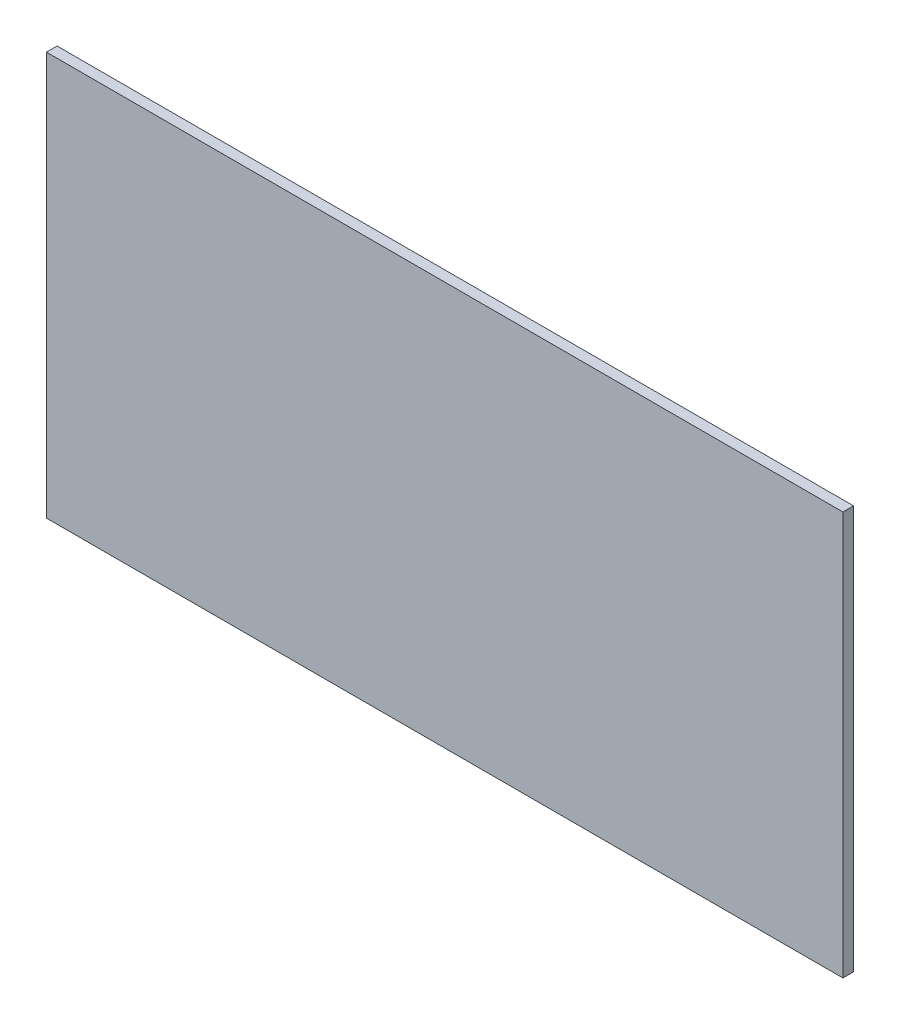
ISO-10303-21;
HEADER;
FILE_DESCRIPTION(('STEP AP214'),'2;1');
FILE_NAME('part.step','',(''),(''),'','','');
FILE_SCHEMA(('AUTOMOTIVE_DESIGN { 1 0 10303 214 1 1 1 1 }'));
ENDSEC;
DATA;
#1=APPLICATION_CONTEXT('core data for automotive mechanical design processes');
#2=APPLICATION_PROTOCOL_DEFINITION('international standard','automotive_design',2000,#1);
#3=PRODUCT_CONTEXT('',#1,'mechanical');
#4=PRODUCT('Part','Part','',(#3));
#5=PRODUCT_RELATED_PRODUCT_CATEGORY('part','',(#4));
#6=PRODUCT_DEFINITION_FORMATION('','',#4);
#7=PRODUCT_DEFINITION_CONTEXT('part definition',#1,'design');
#8=PRODUCT_DEFINITION('design','',#6,#7);
#9=PRODUCT_DEFINITION_SHAPE('','',#8);
#10=(LENGTH_UNIT() NAMED_UNIT(*) SI_UNIT(.MILLI.,.METRE.));
#11=(NAMED_UNIT(*) PLANE_ANGLE_UNIT() SI_UNIT($,.RADIAN.));
#12=(NAMED_UNIT(*) SI_UNIT($,.STERADIAN.) SOLID_ANGLE_UNIT());
#13=UNCERTAINTY_MEASURE_WITH_UNIT(LENGTH_MEASURE(1.E-05),#10,'distance_accuracy_value','');
#14=(GEOMETRIC_REPRESENTATION_CONTEXT(3) GLOBAL_UNCERTAINTY_ASSIGNED_CONTEXT((#13)) GLOBAL_UNIT_ASSIGNED_CONTEXT((#10,
#11,#12)) REPRESENTATION_CONTEXT('',''));
#15=CARTESIAN_POINT('',(0.,0.,0.));
#16=DIRECTION('',(0.,0.,1.));
#17=DIRECTION('',(1.,0.,0.));
#18=AXIS2_PLACEMENT_3D('',#15,#16,#17);
#19=CARTESIAN_POINT('',(37.5,-19.,1.));
#20=DIRECTION('',(-1.,0.,0.));
#21=DIRECTION('',(0.,0.,1.));
#22=AXIS2_PLACEMENT_3D('',#19,#20,#21);
#23=PLANE('',#22);
#24=DIRECTION('',(0.,1.,0.));
#25=VECTOR('',#24,1.);
#26=CARTESIAN_POINT('',(37.5,-19.,0.));
#27=LINE('',#26,#25);
#28=CARTESIAN_POINT('',(37.5,-19.,0.));
#29=VERTEX_POINT('',#28);
#30=CARTESIAN_POINT('',(37.5,19.,0.));
#31=VERTEX_POINT('',#30);
#32=EDGE_CURVE('E95',#29,#31,#27,.T.);
#33=ORIENTED_EDGE('',*,*,#32,.T.);
#34=DIRECTION('',(0.,0.,-1.));
#35=VECTOR('',#34,1.);
#36=CARTESIAN_POINT('',(37.5,19.,1.));
#37=LINE('',#36,#35);
#38=CARTESIAN_POINT('',(37.5,19.,1.));
#39=VERTEX_POINT('',#38);
#40=EDGE_CURVE('E11',#39,#31,#37,.T.);
#41=ORIENTED_EDGE('',*,*,#40,.F.);
#42=DIRECTION('',(0.,1.,0.));
#43=VECTOR('',#42,1.);
#44=CARTESIAN_POINT('',(37.5,-19.,1.));
#45=LINE('',#44,#43);
#46=CARTESIAN_POINT('',(37.5,-19.,1.));
#47=VERTEX_POINT('',#46);
#48=EDGE_CURVE('E83',#47,#39,#45,.T.);
#49=ORIENTED_EDGE('',*,*,#48,.F.);
#50=DIRECTION('',(0.,0.,-1.));
#51=VECTOR('',#50,1.);
#52=CARTESIAN_POINT('',(37.5,-19.,1.));
#53=LINE('',#52,#51);
#54=EDGE_CURVE('E91',#47,#29,#53,.T.);
#55=ORIENTED_EDGE('',*,*,#54,.T.);
#56=EDGE_LOOP('',(#33,#41,#49,#55));
#57=FACE_BOUND('',#56,.T.);
#58=ADVANCED_FACE('F32',(#57),#23,.F.);
#59=CARTESIAN_POINT('',(-37.5,19.,1.));
#60=DIRECTION('',(0.,-1.,0.));
#61=DIRECTION('',(0.,0.,-1.));
#62=AXIS2_PLACEMENT_3D('',#59,#60,#61);
#63=PLANE('',#62);
#64=DIRECTION('',(-1.,0.,0.));
#65=VECTOR('',#64,1.);
#66=CARTESIAN_POINT('',(-37.5,19.,0.));
#67=LINE('',#66,#65);
#68=CARTESIAN_POINT('',(-37.5,19.,0.));
#69=VERTEX_POINT('',#68);
#70=EDGE_CURVE('E87',#31,#69,#67,.T.);
#71=ORIENTED_EDGE('',*,*,#70,.T.);
#72=DIRECTION('',(0.,0.,-1.));
#73=VECTOR('',#72,1.);
#74=CARTESIAN_POINT('',(-37.5,19.,1.));
#75=LINE('',#74,#73);
#76=CARTESIAN_POINT('',(-37.5,19.,1.));
#77=VERTEX_POINT('',#76);
#78=EDGE_CURVE('E40',#77,#69,#75,.T.);
#79=ORIENTED_EDGE('',*,*,#78,.F.);
#80=DIRECTION('',(-1.,0.,0.));
#81=VECTOR('',#80,1.);
#82=CARTESIAN_POINT('',(-37.5,19.,1.));
#83=LINE('',#82,#81);
#84=EDGE_CURVE('E78',#39,#77,#83,.T.);
#85=ORIENTED_EDGE('',*,*,#84,.F.);
#86=ORIENTED_EDGE('',*,*,#40,.T.);
#87=EDGE_LOOP('',(#71,#79,#85,#86));
#88=FACE_BOUND('',#87,.T.);
#89=ADVANCED_FACE('F86',(#88),#63,.F.);
#90=CARTESIAN_POINT('',(-37.5,-19.,1.));
#91=DIRECTION('',(1.,0.,0.));
#92=DIRECTION('',(0.,0.,-1.));
#93=AXIS2_PLACEMENT_3D('',#90,#91,#92);
#94=PLANE('',#93);
#95=DIRECTION('',(0.,-1.,0.));
#96=VECTOR('',#95,1.);
#97=CARTESIAN_POINT('',(-37.5,-19.,0.));
#98=LINE('',#97,#96);
#99=CARTESIAN_POINT('',(-37.5,-19.,0.));
#100=VERTEX_POINT('',#99);
#101=EDGE_CURVE('E65',#69,#100,#98,.T.);
#102=ORIENTED_EDGE('',*,*,#101,.T.);
#103=DIRECTION('',(0.,0.,-1.));
#104=VECTOR('',#103,1.);
#105=CARTESIAN_POINT('',(-37.5,-19.,1.));
#106=LINE('',#105,#104);
#107=CARTESIAN_POINT('',(-37.5,-19.,1.));
#108=VERTEX_POINT('',#107);
#109=EDGE_CURVE('E88',#108,#100,#106,.T.);
#110=ORIENTED_EDGE('',*,*,#109,.F.);
#111=DIRECTION('',(0.,-1.,0.));
#112=VECTOR('',#111,1.);
#113=CARTESIAN_POINT('',(-37.5,-19.,1.));
#114=LINE('',#113,#112);
#115=EDGE_CURVE('E81',#77,#108,#114,.T.);
#116=ORIENTED_EDGE('',*,*,#115,.F.);
#117=ORIENTED_EDGE('',*,*,#78,.T.);
#118=EDGE_LOOP('',(#102,#110,#116,#117));
#119=FACE_BOUND('',#118,.T.);
#120=ADVANCED_FACE('F89',(#119),#94,.F.);
#121=CARTESIAN_POINT('',(-37.5,-19.,1.));
#122=DIRECTION('',(0.,1.,0.));
#123=DIRECTION('',(0.,0.,1.));
#124=AXIS2_PLACEMENT_3D('',#121,#122,#123);
#125=PLANE('',#124);
#126=DIRECTION('',(1.,0.,0.));
#127=VECTOR('',#126,1.);
#128=CARTESIAN_POINT('',(-37.5,-19.,0.));
#129=LINE('',#128,#127);
#130=EDGE_CURVE('E71',#100,#29,#129,.T.);
#131=ORIENTED_EDGE('',*,*,#130,.T.);
#132=ORIENTED_EDGE('',*,*,#54,.F.);
#133=DIRECTION('',(1.,0.,0.));
#134=VECTOR('',#133,1.);
#135=CARTESIAN_POINT('',(-37.5,-19.,1.));
#136=LINE('',#135,#134);
#137=EDGE_CURVE('E48',#108,#47,#136,.T.);
#138=ORIENTED_EDGE('',*,*,#137,.F.);
#139=ORIENTED_EDGE('',*,*,#109,.T.);
#140=EDGE_LOOP('',(#131,#132,#138,#139));
#141=FACE_BOUND('',#140,.T.);
#142=ADVANCED_FACE('F102',(#141),#125,.F.);
#143=CARTESIAN_POINT('',(0.,0.,1.));
#144=DIRECTION('',(0.,0.,-1.));
#145=DIRECTION('',(-1.,0.,0.));
#146=AXIS2_PLACEMENT_3D('',#143,#144,#145);
#147=PLANE('',#146);
#148=ORIENTED_EDGE('',*,*,#48,.T.);
#149=ORIENTED_EDGE('',*,*,#84,.T.);
#150=ORIENTED_EDGE('',*,*,#115,.T.);
#151=ORIENTED_EDGE('',*,*,#137,.T.);
#152=EDGE_LOOP('',(#148,#149,#150,#151));
#153=FACE_BOUND('',#152,.T.);
#154=ADVANCED_FACE('F79',(#153),#147,.F.);
#155=CARTESIAN_POINT('',(0.,0.,0.));
#156=DIRECTION('',(0.,0.,-1.));
#157=DIRECTION('',(-1.,0.,0.));
#158=AXIS2_PLACEMENT_3D('',#155,#156,#157);
#159=PLANE('',#158);
#160=ORIENTED_EDGE('',*,*,#32,.F.);
#161=ORIENTED_EDGE('',*,*,#130,.F.);
#162=ORIENTED_EDGE('',*,*,#101,.F.);
#163=ORIENTED_EDGE('',*,*,#70,.F.);
#164=EDGE_LOOP('',(#160,#161,#162,#163));
#165=FACE_BOUND('',#164,.T.);
#166=ADVANCED_FACE('F105',(#165),#159,.T.);
#167=CLOSED_SHELL('',(#58,#89,#120,#142,#154,#166));
#168=MANIFOLD_SOLID_BREP('B2',#167);
#169=ADVANCED_BREP_SHAPE_REPRESENTATION('',(#18,#168),#14);
#170=SHAPE_DEFINITION_REPRESENTATION(#9,#169);
ENDSEC;
END-ISO-10303-21;
